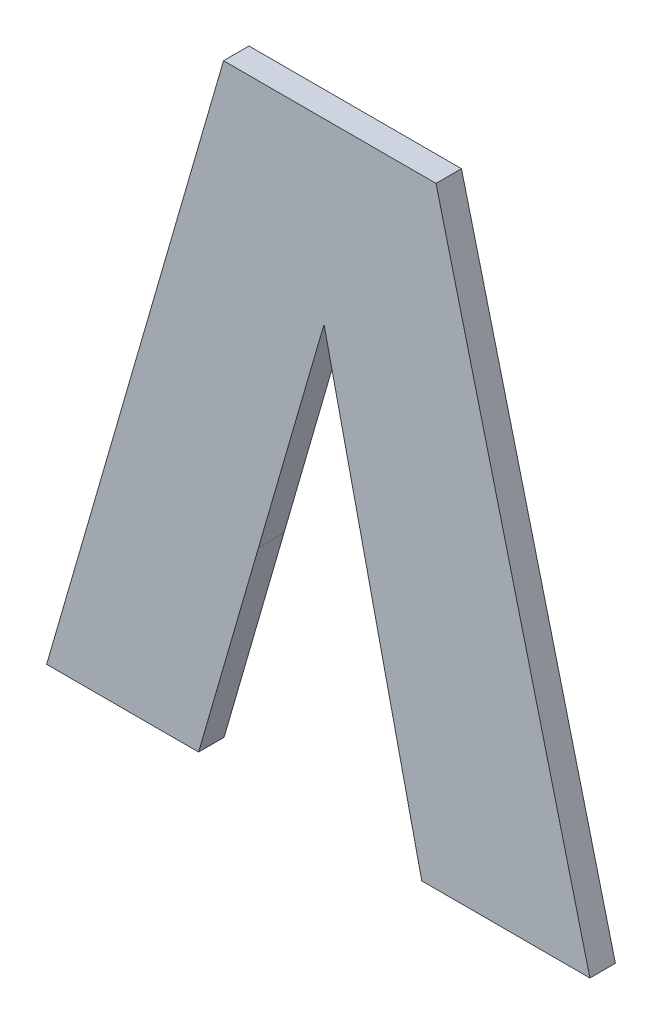
ISO-10303-21;
HEADER;
FILE_DESCRIPTION(('STEP AP214'),'2;1');
FILE_NAME('part.step','',(''),(''),'','','');
FILE_SCHEMA(('AUTOMOTIVE_DESIGN { 1 0 10303 214 1 1 1 1 }'));
ENDSEC;
DATA;
#1=APPLICATION_CONTEXT('core data for automotive mechanical design processes');
#2=APPLICATION_PROTOCOL_DEFINITION('international standard','automotive_design',2000,#1);
#3=PRODUCT_CONTEXT('',#1,'mechanical');
#4=PRODUCT('Part','Part','',(#3));
#5=PRODUCT_RELATED_PRODUCT_CATEGORY('part','',(#4));
#6=PRODUCT_DEFINITION_FORMATION('','',#4);
#7=PRODUCT_DEFINITION_CONTEXT('part definition',#1,'design');
#8=PRODUCT_DEFINITION('design','',#6,#7);
#9=PRODUCT_DEFINITION_SHAPE('','',#8);
#10=(LENGTH_UNIT() NAMED_UNIT(*) SI_UNIT(.MILLI.,.METRE.));
#11=(NAMED_UNIT(*) PLANE_ANGLE_UNIT() SI_UNIT($,.RADIAN.));
#12=(NAMED_UNIT(*) SI_UNIT($,.STERADIAN.) SOLID_ANGLE_UNIT());
#13=UNCERTAINTY_MEASURE_WITH_UNIT(LENGTH_MEASURE(1.E-05),#10,'distance_accuracy_value','');
#14=(GEOMETRIC_REPRESENTATION_CONTEXT(3) GLOBAL_UNCERTAINTY_ASSIGNED_CONTEXT((#13)) GLOBAL_UNIT_ASSIGNED_CONTEXT((#10,
#11,#12)) REPRESENTATION_CONTEXT('',''));
#15=CARTESIAN_POINT('',(0.,0.,0.));
#16=DIRECTION('',(0.,0.,1.));
#17=DIRECTION('',(1.,0.,0.));
#18=AXIS2_PLACEMENT_3D('',#15,#16,#17);
#19=CARTESIAN_POINT('',(10.2113381410256,12.5,0.5));
#20=DIRECTION('',(-0.969729737442709,-0.244180745185394,0.));
#21=DIRECTION('',(0.244180745185394,-0.969729737442709,0.));
#22=AXIS2_PLACEMENT_3D('',#19,#20,#21);
#23=PLANE('',#22);
#24=DIRECTION('',(0.244180745185394,-0.969729737442709,0.));
#25=VECTOR('',#24,1.);
#26=CARTESIAN_POINT('',(10.2113381410256,12.5,1.));
#27=LINE('',#26,#25);
#28=CARTESIAN_POINT('',(10.2113381410256,12.5,1.));
#29=VERTEX_POINT('',#28);
#30=CARTESIAN_POINT('',(13.2329727564103,0.5,1.));
#31=VERTEX_POINT('',#30);
#32=EDGE_CURVE('E143',#29,#31,#27,.T.);
#33=ORIENTED_EDGE('',*,*,#32,.T.);
#34=DIRECTION('',(0.,0.,-1.));
#35=VECTOR('',#34,1.);
#36=CARTESIAN_POINT('',(13.2329727564103,0.5,0.5));
#37=LINE('',#36,#35);
#38=CARTESIAN_POINT('',(13.2329727564103,0.5,0.500000000000082));
#39=VERTEX_POINT('',#38);
#40=EDGE_CURVE('E59',#31,#39,#37,.T.);
#41=ORIENTED_EDGE('',*,*,#40,.T.);
#42=DIRECTION('',(0.244180745185394,-0.969729737442709,0.));
#43=VECTOR('',#42,1.);
#44=CARTESIAN_POINT('',(10.2113381410256,12.5,0.5));
#45=LINE('',#44,#43);
#46=CARTESIAN_POINT('',(10.2113381410256,12.5,0.5));
#47=VERTEX_POINT('',#46);
#48=EDGE_CURVE('E117',#47,#39,#45,.T.);
#49=ORIENTED_EDGE('',*,*,#48,.F.);
#50=DIRECTION('',(0.,0.,1.));
#51=VECTOR('',#50,1.);
#52=CARTESIAN_POINT('',(10.2113381410256,12.5,0.5));
#53=LINE('',#52,#51);
#54=EDGE_CURVE('E118',#47,#29,#53,.T.);
#55=ORIENTED_EDGE('',*,*,#54,.T.);
#56=EDGE_LOOP('',(#33,#41,#49,#55));
#57=FACE_BOUND('',#56,.T.);
#58=ADVANCED_FACE('F39',(#57),#23,.F.);
#59=CARTESIAN_POINT('',(12.8655849358974,-12.5,0.5));
#60=DIRECTION('',(0.975461590630914,0.220169673669664,0.));
#61=DIRECTION('',(-0.220169673669664,0.975461590630915,0.));
#62=AXIS2_PLACEMENT_3D('',#59,#60,#61);
#63=PLANE('',#62);
#64=DIRECTION('',(-0.220169673669664,0.975461590630914,0.));
#65=VECTOR('',#64,1.);
#66=CARTESIAN_POINT('',(12.8655849358974,-12.5,0.5));
#67=LINE('',#66,#65);
#68=CARTESIAN_POINT('',(9.93137841746916,0.5,0.5));
#69=VERTEX_POINT('',#68);
#70=CARTESIAN_POINT('',(9.15464743589743,3.94130608974359,0.5));
#71=VERTEX_POINT('',#70);
#72=EDGE_CURVE('E43',#69,#71,#67,.T.);
#73=ORIENTED_EDGE('',*,*,#72,.F.);
#74=DIRECTION('',(0.,0.,1.));
#75=VECTOR('',#74,1.);
#76=CARTESIAN_POINT('',(9.93137841746916,0.5,0.5));
#77=LINE('',#76,#75);
#78=CARTESIAN_POINT('',(9.93137841746916,0.5,1.));
#79=VERTEX_POINT('',#78);
#80=EDGE_CURVE('E137',#69,#79,#77,.T.);
#81=ORIENTED_EDGE('',*,*,#80,.T.);
#82=DIRECTION('',(-0.220169673669664,0.975461590630914,0.));
#83=VECTOR('',#82,1.);
#84=CARTESIAN_POINT('',(12.8655849358974,-12.5,1.));
#85=LINE('',#84,#83);
#86=CARTESIAN_POINT('',(9.15464743589743,3.94130608974359,1.));
#87=VERTEX_POINT('',#86);
#88=EDGE_CURVE('E145',#79,#87,#85,.T.);
#89=ORIENTED_EDGE('',*,*,#88,.T.);
#90=DIRECTION('',(0.,0.,1.));
#91=VECTOR('',#90,1.);
#92=CARTESIAN_POINT('',(9.15464743589743,3.94130608974359,0.5));
#93=LINE('',#92,#91);
#94=EDGE_CURVE('E150',#71,#87,#93,.T.);
#95=ORIENTED_EDGE('',*,*,#94,.F.);
#96=EDGE_LOOP('',(#73,#81,#89,#95));
#97=FACE_BOUND('',#96,.T.);
#98=ADVANCED_FACE('F205',(#97),#63,.F.);
#99=CARTESIAN_POINT('',(6.72576121794871,4.56229967948718,0.5));
#100=DIRECTION('',(-0.960582097853071,0.277996462718852,0.));
#101=DIRECTION('',(-0.277996462718852,-0.960582097853071,0.));
#102=AXIS2_PLACEMENT_3D('',#99,#100,#101);
#103=PLANE('',#102);
#104=DIRECTION('',(-0.277996462718852,-0.960582097853071,0.));
#105=VECTOR('',#104,1.);
#106=CARTESIAN_POINT('',(6.72576121794871,4.56229967948718,1.));
#107=LINE('',#106,#105);
#108=CARTESIAN_POINT('',(6.72576121794871,4.56229967948718,1.));
#109=VERTEX_POINT('',#108);
#110=CARTESIAN_POINT('',(5.55011475948838,0.5,1.));
#111=VERTEX_POINT('',#110);
#112=EDGE_CURVE('E345',#109,#111,#107,.T.);
#113=ORIENTED_EDGE('',*,*,#112,.T.);
#114=DIRECTION('',(0.,0.,-1.));
#115=VECTOR('',#114,1.);
#116=CARTESIAN_POINT('',(5.55011475948838,0.5,0.5));
#117=LINE('',#116,#115);
#118=CARTESIAN_POINT('',(5.55011475948838,0.5,0.499999999999891));
#119=VERTEX_POINT('',#118);
#120=EDGE_CURVE('E74',#111,#119,#117,.T.);
#121=ORIENTED_EDGE('',*,*,#120,.T.);
#122=DIRECTION('',(-0.277996462718852,-0.960582097853071,0.));
#123=VECTOR('',#122,1.);
#124=CARTESIAN_POINT('',(6.72576121794871,4.56229967948718,0.5));
#125=LINE('',#124,#123);
#126=CARTESIAN_POINT('',(6.72576121794871,4.56229967948718,0.5));
#127=VERTEX_POINT('',#126);
#128=EDGE_CURVE('E172',#127,#119,#125,.T.);
#129=ORIENTED_EDGE('',*,*,#128,.F.);
#130=DIRECTION('',(0.,0.,1.));
#131=VECTOR('',#130,1.);
#132=CARTESIAN_POINT('',(6.72576121794871,4.56229967948718,0.5));
#133=LINE('',#132,#131);
#134=EDGE_CURVE('E152',#127,#109,#133,.T.);
#135=ORIENTED_EDGE('',*,*,#134,.T.);
#136=EDGE_LOOP('',(#113,#121,#129,#135));
#137=FACE_BOUND('',#136,.T.);
#138=ADVANCED_FACE('F200',(#137),#103,.F.);
#139=CARTESIAN_POINT('',(0.626001602564093,-6.20492788461538,0.5));
#140=DIRECTION('',(0.960576917131283,-0.278014363432107,0.));
#141=DIRECTION('',(0.278014363432107,0.960576917131283,0.));
#142=AXIS2_PLACEMENT_3D('',#139,#140,#141);
#143=PLANE('',#142);
#144=DIRECTION('',(0.278014363432107,0.960576917131283,0.));
#145=VECTOR('',#144,1.);
#146=CARTESIAN_POINT('',(0.626001602564093,-6.20492788461538,0.5));
#147=LINE('',#146,#145);
#148=CARTESIAN_POINT('',(2.56657109206054,0.5,0.499999999999817));
#149=VERTEX_POINT('',#148);
#150=CARTESIAN_POINT('',(6.03966346153845,12.5,0.5));
#151=VERTEX_POINT('',#150);
#152=EDGE_CURVE('E127',#149,#151,#147,.T.);
#153=ORIENTED_EDGE('',*,*,#152,.F.);
#154=DIRECTION('',(0.,0.,1.));
#155=VECTOR('',#154,1.);
#156=CARTESIAN_POINT('',(2.56657109206054,0.5,0.5));
#157=LINE('',#156,#155);
#158=CARTESIAN_POINT('',(2.56657109206054,0.5,1.));
#159=VERTEX_POINT('',#158);
#160=EDGE_CURVE('E79',#149,#159,#157,.T.);
#161=ORIENTED_EDGE('',*,*,#160,.T.);
#162=DIRECTION('',(0.278014363432107,0.960576917131283,0.));
#163=VECTOR('',#162,1.);
#164=CARTESIAN_POINT('',(0.626001602564093,-6.20492788461538,1.));
#165=LINE('',#164,#163);
#166=CARTESIAN_POINT('',(6.03966346153845,12.5,1.));
#167=VERTEX_POINT('',#166);
#168=EDGE_CURVE('E124',#159,#167,#165,.T.);
#169=ORIENTED_EDGE('',*,*,#168,.T.);
#170=DIRECTION('',(0.,0.,1.));
#171=VECTOR('',#170,1.);
#172=CARTESIAN_POINT('',(6.03966346153845,12.5,0.5));
#173=LINE('',#172,#171);
#174=EDGE_CURVE('E151',#151,#167,#173,.T.);
#175=ORIENTED_EDGE('',*,*,#174,.F.);
#176=EDGE_LOOP('',(#153,#161,#169,#175));
#177=FACE_BOUND('',#176,.T.);
#178=ADVANCED_FACE('F193',(#177),#143,.F.);
#179=CARTESIAN_POINT('',(8.5816551653171,6.47238776818213,0.5));
#180=DIRECTION('',(0.,0.,1.));
#181=DIRECTION('',(1.,0.,0.));
#182=AXIS2_PLACEMENT_3D('',#179,#180,#181);
#183=PLANE('',#182);
#184=ORIENTED_EDGE('',*,*,#48,.T.);
#185=DIRECTION('',(-1.,0.,0.));
#186=VECTOR('',#185,1.);
#187=CARTESIAN_POINT('',(8.5816551653171,0.5,0.499999999999933));
#188=LINE('',#187,#186);
#189=EDGE_CURVE('E125',#39,#69,#188,.T.);
#190=ORIENTED_EDGE('',*,*,#189,.T.);
#191=ORIENTED_EDGE('',*,*,#72,.T.);
#192=CARTESIAN_POINT('',(9.15464743589743,3.94130608974359,0.5));
#193=CARTESIAN_POINT('',(8.96232357392905,4.78925065543088,0.5));
#194=CARTESIAN_POINT('',(8.57963931865571,6.47648296925819,0.5));
#195=CARTESIAN_POINT('',(8.2011127359119,8.16465290002522,0.5));
#196=CARTESIAN_POINT('',(8.01282051282051,9.00440705128206,0.5));
#197=B_SPLINE_CURVE_WITH_KNOTS('',3,(#192,#193,#194,#195,#196),.UNSPECIFIED.,.F.,.F.,(4,1,4),
(0.,0.502565389921804,1.),.UNSPECIFIED.);
#198=CARTESIAN_POINT('',(8.01282051282051,9.00440705128206,0.5));
#199=VERTEX_POINT('',#198);
#200=EDGE_CURVE('E176',#71,#199,#197,.T.);
#201=ORIENTED_EDGE('',*,*,#200,.T.);
#202=CARTESIAN_POINT('',(8.01282051282051,9.00440705128205,0.5));
#203=CARTESIAN_POINT('',(7.92367005315903,8.70245224240454,0.5));
#204=CARTESIAN_POINT('',(7.75537023031622,8.13241658545348,0.5));
#205=CARTESIAN_POINT('',(7.52786148563017,7.32433611109758,0.5));
#206=CARTESIAN_POINT('',(7.32122258259069,6.61906594156315,0.5));
#207=CARTESIAN_POINT('',(7.14517684239162,6.01331821422761,0.5));
#208=CARTESIAN_POINT('',(7.00263328611851,5.50624188828153,0.5));
#209=CARTESIAN_POINT('',(6.87956279961947,5.10406789363935,0.5));
#210=CARTESIAN_POINT('',(6.79567949317294,4.79892034995316,0.5));
#211=CARTESIAN_POINT('',(6.74597009438951,4.63069149661154,0.5));
#212=CARTESIAN_POINT('',(6.72576121794871,4.56229967948718,0.5));
#213=B_SPLINE_CURVE_WITH_KNOTS('',3,(#202,#203,#204,#205,#206,#207,#208,#209,#210,#211,#212),
.UNSPECIFIED.,.F.,.F.,(4,1,1,1,1,1,1,1,4),(0.,0.20422615407791,0.385541764806321,
0.544547923962639,0.680944400424359,0.794731570821503,0.886211806481934,0.953740507841452,1.),.UNSPECIFIED.);
#214=EDGE_CURVE('E169',#199,#127,#213,.T.);
#215=ORIENTED_EDGE('',*,*,#214,.T.);
#216=ORIENTED_EDGE('',*,*,#128,.T.);
#217=EDGE_CURVE('E77',#119,#149,#188,.T.);
#218=ORIENTED_EDGE('',*,*,#217,.T.);
#219=ORIENTED_EDGE('',*,*,#152,.T.);
#220=DIRECTION('',(1.,0.,0.));
#221=VECTOR('',#220,1.);
#222=CARTESIAN_POINT('',(6.03966346153845,12.5,0.5));
#223=LINE('',#222,#221);
#224=EDGE_CURVE('E130',#151,#47,#223,.T.);
#225=ORIENTED_EDGE('',*,*,#224,.T.);
#226=EDGE_LOOP('',(#184,#190,#191,#201,#215,#216,#218,#219,#225));
#227=FACE_BOUND('',#226,.T.);
#228=ADVANCED_FACE('F126',(#227),#183,.F.);
#229=CARTESIAN_POINT('',(8.5816551653171,6.47238776818213,1.));
#230=DIRECTION('',(0.,0.,1.));
#231=DIRECTION('',(1.,0.,0.));
#232=AXIS2_PLACEMENT_3D('',#229,#230,#231);
#233=PLANE('',#232);
#234=ORIENTED_EDGE('',*,*,#168,.F.);
#235=DIRECTION('',(1.,0.,0.));
#236=VECTOR('',#235,1.);
#237=CARTESIAN_POINT('',(-17.,0.5,1.));
#238=LINE('',#237,#236);
#239=EDGE_CURVE('E132',#159,#111,#238,.T.);
#240=ORIENTED_EDGE('',*,*,#239,.T.);
#241=ORIENTED_EDGE('',*,*,#112,.F.);
#242=CARTESIAN_POINT('',(8.01282051282051,9.00440705128205,1.));
#243=CARTESIAN_POINT('',(7.92367005315903,8.70245224240454,1.));
#244=CARTESIAN_POINT('',(7.75537023031622,8.13241658545348,1.));
#245=CARTESIAN_POINT('',(7.52786148563017,7.32433611109758,1.));
#246=CARTESIAN_POINT('',(7.32122258259069,6.61906594156315,1.));
#247=CARTESIAN_POINT('',(7.14517684239162,6.01331821422761,1.));
#248=CARTESIAN_POINT('',(7.00263328611851,5.50624188828153,1.));
#249=CARTESIAN_POINT('',(6.87956279961947,5.10406789363935,1.));
#250=CARTESIAN_POINT('',(6.79567949317294,4.79892034995316,1.));
#251=CARTESIAN_POINT('',(6.74597009438951,4.63069149661154,1.));
#252=CARTESIAN_POINT('',(6.72576121794871,4.56229967948718,1.));
#253=B_SPLINE_CURVE_WITH_KNOTS('',3,(#242,#243,#244,#245,#246,#247,#248,#249,#250,#251,#252),
.UNSPECIFIED.,.F.,.F.,(4,1,1,1,1,1,1,1,4),(0.,0.20422615407791,0.385541764806321,
0.544547923962639,0.680944400424359,0.794731570821503,0.886211806481934,0.953740507841452,1.),.UNSPECIFIED.);
#254=CARTESIAN_POINT('',(8.01282051282051,9.00440705128206,1.));
#255=VERTEX_POINT('',#254);
#256=EDGE_CURVE('E47',#255,#109,#253,.T.);
#257=ORIENTED_EDGE('',*,*,#256,.F.);
#258=CARTESIAN_POINT('',(9.15464743589743,3.94130608974359,1.));
#259=CARTESIAN_POINT('',(8.96232357392905,4.78925065543088,1.));
#260=CARTESIAN_POINT('',(8.57963931865571,6.47648296925819,1.));
#261=CARTESIAN_POINT('',(8.2011127359119,8.16465290002522,1.));
#262=CARTESIAN_POINT('',(8.01282051282051,9.00440705128206,1.));
#263=B_SPLINE_CURVE_WITH_KNOTS('',3,(#258,#259,#260,#261,#262),.UNSPECIFIED.,.F.,.F.,(4,1,4),
(0.,0.502565389921804,1.),.UNSPECIFIED.);
#264=EDGE_CURVE('E146',#87,#255,#263,.T.);
#265=ORIENTED_EDGE('',*,*,#264,.F.);
#266=ORIENTED_EDGE('',*,*,#88,.F.);
#267=EDGE_CURVE('E170',#79,#31,#238,.T.);
#268=ORIENTED_EDGE('',*,*,#267,.T.);
#269=ORIENTED_EDGE('',*,*,#32,.F.);
#270=DIRECTION('',(1.,0.,0.));
#271=VECTOR('',#270,1.);
#272=CARTESIAN_POINT('',(6.03966346153845,12.5,1.));
#273=LINE('',#272,#271);
#274=EDGE_CURVE('E138',#167,#29,#273,.T.);
#275=ORIENTED_EDGE('',*,*,#274,.F.);
#276=EDGE_LOOP('',(#234,#240,#241,#257,#265,#266,#268,#269,#275));
#277=FACE_BOUND('',#276,.T.);
#278=ADVANCED_FACE('F41',(#277),#233,.T.);
#279=CARTESIAN_POINT('',(6.03966346153845,12.5,0.5));
#280=DIRECTION('',(0.,-1.,0.));
#281=DIRECTION('',(0.,0.,-1.));
#282=AXIS2_PLACEMENT_3D('',#279,#280,#281);
#283=PLANE('',#282);
#284=ORIENTED_EDGE('',*,*,#274,.T.);
#285=ORIENTED_EDGE('',*,*,#54,.F.);
#286=ORIENTED_EDGE('',*,*,#224,.F.);
#287=ORIENTED_EDGE('',*,*,#174,.T.);
#288=EDGE_LOOP('',(#284,#285,#286,#287));
#289=FACE_BOUND('',#288,.T.);
#290=ADVANCED_FACE('F136',(#289),#283,.F.);
#291=DIRECTION('',(0.,0.,1.));
#292=VECTOR('',#291,1.);
#293=SURFACE_OF_LINEAR_EXTRUSION('',#197,#292);
#294=ORIENTED_EDGE('',*,*,#264,.T.);
#295=DIRECTION('',(0.,0.,1.));
#296=VECTOR('',#295,1.);
#297=CARTESIAN_POINT('',(8.01282051282051,9.00440705128206,0.5));
#298=LINE('',#297,#296);
#299=EDGE_CURVE('E11',#199,#255,#298,.T.);
#300=ORIENTED_EDGE('',*,*,#299,.F.);
#301=ORIENTED_EDGE('',*,*,#200,.F.);
#302=ORIENTED_EDGE('',*,*,#94,.T.);
#303=EDGE_LOOP('',(#294,#300,#301,#302));
#304=FACE_BOUND('',#303,.T.);
#305=ADVANCED_FACE('F188',(#304),#293,.F.);
#306=DIRECTION('',(0.,0.,1.));
#307=VECTOR('',#306,1.);
#308=SURFACE_OF_LINEAR_EXTRUSION('',#213,#307);
#309=ORIENTED_EDGE('',*,*,#256,.T.);
#310=ORIENTED_EDGE('',*,*,#134,.F.);
#311=ORIENTED_EDGE('',*,*,#214,.F.);
#312=ORIENTED_EDGE('',*,*,#299,.T.);
#313=EDGE_LOOP('',(#309,#310,#311,#312));
#314=FACE_BOUND('',#313,.T.);
#315=ADVANCED_FACE('F182',(#314),#308,.F.);
#316=CARTESIAN_POINT('',(-17.,0.5,1.));
#317=DIRECTION('',(0.,1.,0.));
#318=DIRECTION('',(0.,0.,1.));
#319=AXIS2_PLACEMENT_3D('',#316,#317,#318);
#320=PLANE('',#319);
#321=ORIENTED_EDGE('',*,*,#239,.F.);
#322=ORIENTED_EDGE('',*,*,#160,.F.);
#323=ORIENTED_EDGE('',*,*,#217,.F.);
#324=ORIENTED_EDGE('',*,*,#120,.F.);
#325=EDGE_LOOP('',(#321,#322,#323,#324));
#326=FACE_BOUND('',#325,.T.);
#327=ADVANCED_FACE('F187',(#326),#320,.F.);
#328=ORIENTED_EDGE('',*,*,#267,.F.);
#329=ORIENTED_EDGE('',*,*,#80,.F.);
#330=ORIENTED_EDGE('',*,*,#189,.F.);
#331=ORIENTED_EDGE('',*,*,#40,.F.);
#332=EDGE_LOOP('',(#328,#329,#330,#331));
#333=FACE_BOUND('',#332,.T.);
#334=ADVANCED_FACE('F195',(#333),#320,.F.);
#335=CLOSED_SHELL('',(#58,#98,#138,#178,#228,#278,#290,#305,#315,#327,#334));
#336=MANIFOLD_SOLID_BREP('B2',#335);
#337=ADVANCED_BREP_SHAPE_REPRESENTATION('',(#18,#336),#14);
#338=SHAPE_DEFINITION_REPRESENTATION(#9,#337);
ENDSEC;
END-ISO-10303-21;
